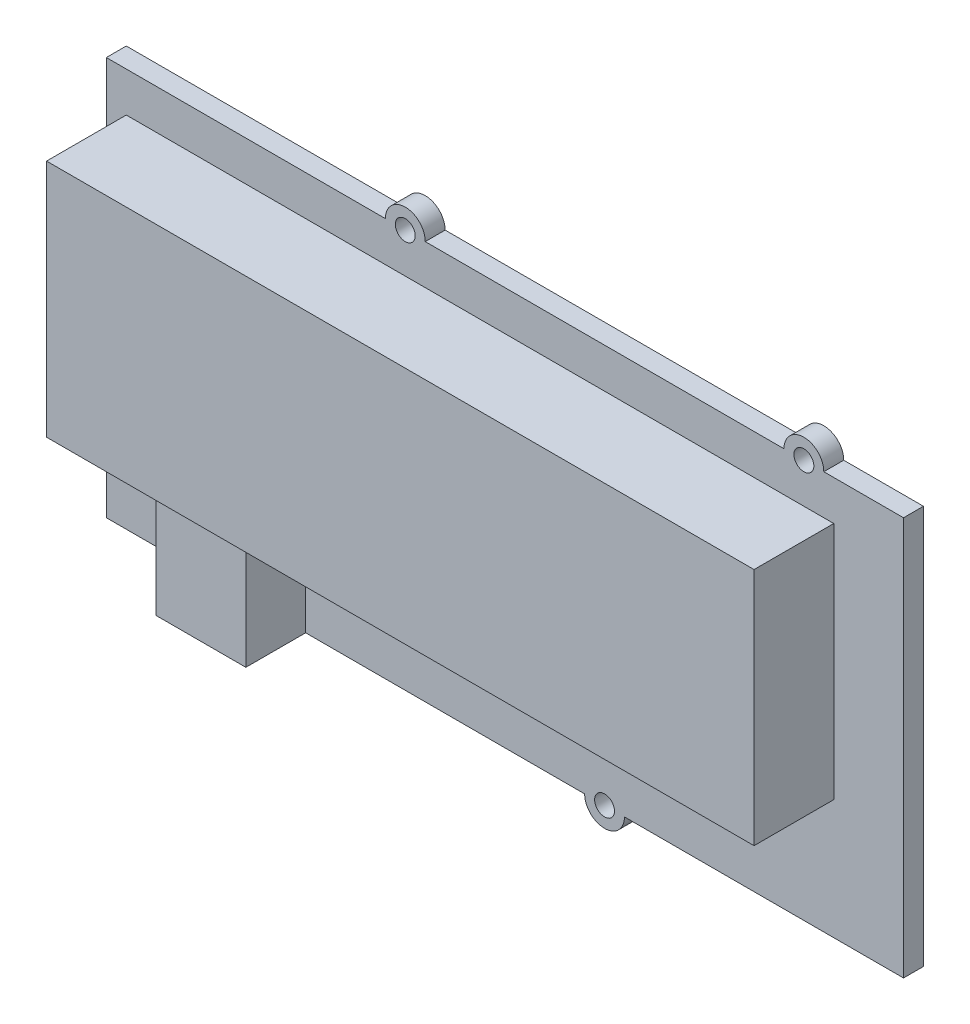
ISO-10303-21;
HEADER;
FILE_DESCRIPTION(('STEP AP214'),'2;1');
FILE_NAME('part.step','',(''),(''),'','','');
FILE_SCHEMA(('AUTOMOTIVE_DESIGN { 1 0 10303 214 1 1 1 1 }'));
ENDSEC;
DATA;
#1=APPLICATION_CONTEXT('core data for automotive mechanical design processes');
#2=APPLICATION_PROTOCOL_DEFINITION('international standard','automotive_design',2000,#1);
#3=PRODUCT_CONTEXT('',#1,'mechanical');
#4=PRODUCT('Part','Part','',(#3));
#5=PRODUCT_RELATED_PRODUCT_CATEGORY('part','',(#4));
#6=PRODUCT_DEFINITION_FORMATION('','',#4);
#7=PRODUCT_DEFINITION_CONTEXT('part definition',#1,'design');
#8=PRODUCT_DEFINITION('design','',#6,#7);
#9=PRODUCT_DEFINITION_SHAPE('','',#8);
#10=(LENGTH_UNIT() NAMED_UNIT(*) SI_UNIT(.MILLI.,.METRE.));
#11=(NAMED_UNIT(*) PLANE_ANGLE_UNIT() SI_UNIT($,.RADIAN.));
#12=(NAMED_UNIT(*) SI_UNIT($,.STERADIAN.) SOLID_ANGLE_UNIT());
#13=UNCERTAINTY_MEASURE_WITH_UNIT(LENGTH_MEASURE(1.E-05),#10,'distance_accuracy_value','');
#14=(GEOMETRIC_REPRESENTATION_CONTEXT(3) GLOBAL_UNCERTAINTY_ASSIGNED_CONTEXT((#13)) GLOBAL_UNIT_ASSIGNED_CONTEXT((#10,
#11,#12)) REPRESENTATION_CONTEXT('',''));
#15=CARTESIAN_POINT('',(0.,0.,0.));
#16=DIRECTION('',(0.,0.,1.));
#17=DIRECTION('',(1.,0.,0.));
#18=AXIS2_PLACEMENT_3D('',#15,#16,#17);
#19=CARTESIAN_POINT('',(0.,0.,2.));
#20=DIRECTION('',(0.,0.,1.));
#21=DIRECTION('',(1.,0.,0.));
#22=AXIS2_PLACEMENT_3D('',#19,#20,#21);
#23=PLANE('',#22);
#24=CARTESIAN_POINT('',(22.3997823196179,9.75675263033948,2.));
#25=DIRECTION('',(0.,0.,1.));
#26=DIRECTION('',(1.,0.,0.));
#27=AXIS2_PLACEMENT_3D('',#24,#25,#26);
#28=CIRCLE('',#27,0.999999999999998);
#29=CARTESIAN_POINT('',(23.3997823196179,9.75675263033948,2.));
#30=VERTEX_POINT('',#29);
#31=EDGE_CURVE('E249',#30,#30,#28,.T.);
#32=ORIENTED_EDGE('',*,*,#31,.F.);
#33=EDGE_LOOP('',(#32));
#34=FACE_BOUND('',#33,.T.);
#35=CARTESIAN_POINT('',(-17.6002176803821,9.75675263033948,2.));
#36=DIRECTION('',(0.,0.,1.));
#37=DIRECTION('',(1.,0.,0.));
#38=AXIS2_PLACEMENT_3D('',#35,#36,#37);
#39=CIRCLE('',#38,1.);
#40=CARTESIAN_POINT('',(-16.6002176803821,9.75675263033948,2.));
#41=VERTEX_POINT('',#40);
#42=EDGE_CURVE('E253',#41,#41,#39,.T.);
#43=ORIENTED_EDGE('',*,*,#42,.F.);
#44=EDGE_LOOP('',(#43));
#45=FACE_BOUND('',#44,.T.);
#46=CARTESIAN_POINT('',(2.39978231961789,-30.2432473696605,2.));
#47=DIRECTION('',(0.,0.,1.));
#48=DIRECTION('',(1.,0.,0.));
#49=AXIS2_PLACEMENT_3D('',#46,#47,#48);
#50=CIRCLE('',#49,1.);
#51=CARTESIAN_POINT('',(3.39978231961789,-30.2432473696605,2.));
#52=VERTEX_POINT('',#51);
#53=EDGE_CURVE('E258',#52,#52,#50,.T.);
#54=ORIENTED_EDGE('',*,*,#53,.F.);
#55=EDGE_LOOP('',(#54));
#56=FACE_BOUND('',#55,.T.);
#57=DIRECTION('',(1.,0.,0.));
#58=VECTOR('',#57,1.);
#59=CARTESIAN_POINT('',(0.,-30.2432473696605,2.));
#60=LINE('',#59,#58);
#61=CARTESIAN_POINT('',(-47.6002176803821,-30.2432473696605,2.));
#62=VERTEX_POINT('',#61);
#63=CARTESIAN_POINT('',(-36.6002176803821,-30.2432473696605,2.));
#64=VERTEX_POINT('',#63);
#65=EDGE_CURVE('E263',#62,#64,#60,.T.);
#66=ORIENTED_EDGE('',*,*,#65,.T.);
#67=DIRECTION('',(0.,-1.,0.));
#68=VECTOR('',#67,1.);
#69=CARTESIAN_POINT('',(-36.6002176803821,-18.2432473696605,2.));
#70=LINE('',#69,#68);
#71=CARTESIAN_POINT('',(-36.6002176803821,-18.2432473696605,2.));
#72=VERTEX_POINT('',#71);
#73=EDGE_CURVE('E197',#72,#64,#70,.T.);
#74=ORIENTED_EDGE('',*,*,#73,.F.);
#75=DIRECTION('',(1.,0.,0.));
#76=VECTOR('',#75,1.);
#77=CARTESIAN_POINT('',(-45.6002176803821,-18.2432473696605,2.));
#78=LINE('',#77,#76);
#79=CARTESIAN_POINT('',(-45.6002176803821,-18.2432473696605,2.));
#80=VERTEX_POINT('',#79);
#81=EDGE_CURVE('E223',#80,#72,#78,.T.);
#82=ORIENTED_EDGE('',*,*,#81,.F.);
#83=DIRECTION('',(0.,-1.,0.));
#84=VECTOR('',#83,1.);
#85=CARTESIAN_POINT('',(-45.6002176803821,5.75675263033948,2.));
#86=LINE('',#85,#84);
#87=CARTESIAN_POINT('',(-45.6002176803821,5.75675263033948,2.));
#88=VERTEX_POINT('',#87);
#89=EDGE_CURVE('E69',#88,#80,#86,.T.);
#90=ORIENTED_EDGE('',*,*,#89,.F.);
#91=DIRECTION('',(-1.,0.,0.));
#92=VECTOR('',#91,1.);
#93=CARTESIAN_POINT('',(-45.6002176803821,5.75675263033948,2.));
#94=LINE('',#93,#92);
#95=CARTESIAN_POINT('',(25.3997823196179,5.75675263033948,2.));
#96=VERTEX_POINT('',#95);
#97=EDGE_CURVE('E213',#96,#88,#94,.T.);
#98=ORIENTED_EDGE('',*,*,#97,.F.);
#99=DIRECTION('',(0.,1.,0.));
#100=VECTOR('',#99,1.);
#101=CARTESIAN_POINT('',(25.3997823196179,5.75675263033948,2.));
#102=LINE('',#101,#100);
#103=CARTESIAN_POINT('',(25.3997823196179,-18.2432473696605,2.));
#104=VERTEX_POINT('',#103);
#105=EDGE_CURVE('E227',#104,#96,#102,.T.);
#106=ORIENTED_EDGE('',*,*,#105,.F.);
#107=CARTESIAN_POINT('',(-27.6002176803821,-18.2432473696605,2.));
#108=VERTEX_POINT('',#107);
#109=EDGE_CURVE('E203',#108,#104,#78,.T.);
#110=ORIENTED_EDGE('',*,*,#109,.F.);
#111=DIRECTION('',(0.,1.,0.));
#112=VECTOR('',#111,1.);
#113=CARTESIAN_POINT('',(-27.6002176803821,-18.2432473696605,2.));
#114=LINE('',#113,#112);
#115=CARTESIAN_POINT('',(-27.6002176803821,-30.2432473696605,2.));
#116=VERTEX_POINT('',#115);
#117=EDGE_CURVE('E193',#116,#108,#114,.T.);
#118=ORIENTED_EDGE('',*,*,#117,.F.);
#119=CARTESIAN_POINT('',(0.39978231961789,-30.2432473696605,2.));
#120=VERTEX_POINT('',#119);
#121=EDGE_CURVE('E262',#116,#120,#60,.T.);
#122=ORIENTED_EDGE('',*,*,#121,.T.);
#123=CARTESIAN_POINT('',(2.39978231961789,-30.2432473696605,2.));
#124=DIRECTION('',(0.,0.,1.));
#125=DIRECTION('',(1.,0.,0.));
#126=AXIS2_PLACEMENT_3D('',#123,#124,#125);
#127=CIRCLE('',#126,2.);
#128=CARTESIAN_POINT('',(4.39978231961789,-30.2432473696605,2.));
#129=VERTEX_POINT('',#128);
#130=EDGE_CURVE('E266',#120,#129,#127,.T.);
#131=ORIENTED_EDGE('',*,*,#130,.T.);
#132=DIRECTION('',(-1.,0.,0.));
#133=VECTOR('',#132,1.);
#134=CARTESIAN_POINT('',(0.,-30.2432473696605,2.));
#135=LINE('',#134,#133);
#136=CARTESIAN_POINT('',(32.3997823196179,-30.2432473696605,2.));
#137=VERTEX_POINT('',#136);
#138=EDGE_CURVE('E269',#137,#129,#135,.T.);
#139=ORIENTED_EDGE('',*,*,#138,.F.);
#140=DIRECTION('',(0.,-1.,0.));
#141=VECTOR('',#140,1.);
#142=CARTESIAN_POINT('',(32.3997823196179,0.,2.));
#143=LINE('',#142,#141);
#144=CARTESIAN_POINT('',(32.3997823196179,9.75675263033948,2.));
#145=VERTEX_POINT('',#144);
#146=EDGE_CURVE('E273',#145,#137,#143,.T.);
#147=ORIENTED_EDGE('',*,*,#146,.F.);
#148=DIRECTION('',(1.,0.,0.));
#149=VECTOR('',#148,1.);
#150=CARTESIAN_POINT('',(0.,9.75675263033948,2.));
#151=LINE('',#150,#149);
#152=CARTESIAN_POINT('',(24.3997823196179,9.75675263033948,2.));
#153=VERTEX_POINT('',#152);
#154=EDGE_CURVE('E277',#153,#145,#151,.T.);
#155=ORIENTED_EDGE('',*,*,#154,.F.);
#156=CARTESIAN_POINT('',(22.3997823196179,9.75675263033948,2.));
#157=DIRECTION('',(0.,0.,1.));
#158=DIRECTION('',(1.,0.,0.));
#159=AXIS2_PLACEMENT_3D('',#156,#157,#158);
#160=CIRCLE('',#159,2.);
#161=CARTESIAN_POINT('',(20.3997823196179,9.75675263033948,2.));
#162=VERTEX_POINT('',#161);
#163=EDGE_CURVE('E281',#162,#153,#160,.F.);
#164=ORIENTED_EDGE('',*,*,#163,.F.);
#165=DIRECTION('',(1.,0.,0.));
#166=VECTOR('',#165,1.);
#167=CARTESIAN_POINT('',(0.,9.75675263033948,2.));
#168=LINE('',#167,#166);
#169=CARTESIAN_POINT('',(-15.6002176803821,9.75675263033948,2.));
#170=VERTEX_POINT('',#169);
#171=EDGE_CURVE('E285',#170,#162,#168,.T.);
#172=ORIENTED_EDGE('',*,*,#171,.F.);
#173=CARTESIAN_POINT('',(-17.6002176803821,9.75675263033948,2.));
#174=DIRECTION('',(0.,0.,1.));
#175=DIRECTION('',(1.,0.,0.));
#176=AXIS2_PLACEMENT_3D('',#173,#174,#175);
#177=CIRCLE('',#176,2.);
#178=CARTESIAN_POINT('',(-19.6002176803821,9.75675263033948,2.));
#179=VERTEX_POINT('',#178);
#180=EDGE_CURVE('E289',#179,#170,#177,.F.);
#181=ORIENTED_EDGE('',*,*,#180,.F.);
#182=DIRECTION('',(1.,0.,0.));
#183=VECTOR('',#182,1.);
#184=CARTESIAN_POINT('',(0.,9.75675263033948,2.));
#185=LINE('',#184,#183);
#186=CARTESIAN_POINT('',(-47.6002176803821,9.75675263033948,2.));
#187=VERTEX_POINT('',#186);
#188=EDGE_CURVE('E293',#187,#179,#185,.T.);
#189=ORIENTED_EDGE('',*,*,#188,.F.);
#190=DIRECTION('',(0.,-1.,0.));
#191=VECTOR('',#190,1.);
#192=CARTESIAN_POINT('',(-47.6002176803821,0.,2.));
#193=LINE('',#192,#191);
#194=EDGE_CURVE('E297',#187,#62,#193,.T.);
#195=ORIENTED_EDGE('',*,*,#194,.T.);
#196=EDGE_LOOP('',(#66,#74,#82,#90,#98,#106,#110,#118,#122,#131,#139,#147,#155,#164,#172,#181,
#189,#195));
#197=FACE_BOUND('',#196,.T.);
#198=ADVANCED_FACE('F45',(#34,#45,#56,#197),#23,.T.);
#199=CARTESIAN_POINT('',(-45.6002176803821,-18.2432473696605,10.));
#200=DIRECTION('',(0.,1.,0.));
#201=DIRECTION('',(0.,0.,1.));
#202=AXIS2_PLACEMENT_3D('',#199,#200,#201);
#203=PLANE('',#202);
#204=DIRECTION('',(0.,0.,-1.));
#205=VECTOR('',#204,1.);
#206=CARTESIAN_POINT('',(-36.6002176803821,-18.2432473696605,8.));
#207=LINE('',#206,#205);
#208=CARTESIAN_POINT('',(-36.6002176803821,-18.2432473696605,8.));
#209=VERTEX_POINT('',#208);
#210=EDGE_CURVE('E635',#209,#72,#207,.T.);
#211=ORIENTED_EDGE('',*,*,#210,.F.);
#212=DIRECTION('',(-1.,0.,0.));
#213=VECTOR('',#212,1.);
#214=CARTESIAN_POINT('',(-36.6002176803821,-18.2432473696605,8.));
#215=LINE('',#214,#213);
#216=CARTESIAN_POINT('',(-27.6002176803821,-18.2432473696605,8.));
#217=VERTEX_POINT('',#216);
#218=EDGE_CURVE('E189',#217,#209,#215,.T.);
#219=ORIENTED_EDGE('',*,*,#218,.F.);
#220=DIRECTION('',(0.,0.,-1.));
#221=VECTOR('',#220,1.);
#222=CARTESIAN_POINT('',(-27.6002176803821,-18.2432473696605,8.));
#223=LINE('',#222,#221);
#224=EDGE_CURVE('E61',#217,#108,#223,.T.);
#225=ORIENTED_EDGE('',*,*,#224,.T.);
#226=ORIENTED_EDGE('',*,*,#109,.T.);
#227=DIRECTION('',(0.,0.,-1.));
#228=VECTOR('',#227,1.);
#229=CARTESIAN_POINT('',(25.3997823196179,-18.2432473696605,10.));
#230=LINE('',#229,#228);
#231=CARTESIAN_POINT('',(25.3997823196179,-18.2432473696605,10.));
#232=VERTEX_POINT('',#231);
#233=EDGE_CURVE('E240',#232,#104,#230,.T.);
#234=ORIENTED_EDGE('',*,*,#233,.F.);
#235=DIRECTION('',(1.,0.,0.));
#236=VECTOR('',#235,1.);
#237=CARTESIAN_POINT('',(-45.6002176803821,-18.2432473696605,10.));
#238=LINE('',#237,#236);
#239=CARTESIAN_POINT('',(-45.6002176803821,-18.2432473696605,10.));
#240=VERTEX_POINT('',#239);
#241=EDGE_CURVE('E212',#240,#232,#238,.T.);
#242=ORIENTED_EDGE('',*,*,#241,.F.);
#243=DIRECTION('',(0.,0.,-1.));
#244=VECTOR('',#243,1.);
#245=CARTESIAN_POINT('',(-45.6002176803821,-18.2432473696605,10.));
#246=LINE('',#245,#244);
#247=EDGE_CURVE('E244',#240,#80,#246,.T.);
#248=ORIENTED_EDGE('',*,*,#247,.T.);
#249=ORIENTED_EDGE('',*,*,#81,.T.);
#250=EDGE_LOOP('',(#211,#219,#225,#226,#234,#242,#248,#249));
#251=FACE_BOUND('',#250,.T.);
#252=ADVANCED_FACE('F428',(#251),#203,.F.);
#253=CARTESIAN_POINT('',(0.,-30.2432473696605,2.));
#254=DIRECTION('',(0.,1.,0.));
#255=DIRECTION('',(0.,0.,1.));
#256=AXIS2_PLACEMENT_3D('',#253,#254,#255);
#257=PLANE('',#256);
#258=DIRECTION('',(1.,0.,0.));
#259=VECTOR('',#258,1.);
#260=CARTESIAN_POINT('',(0.,-30.2432473696605,0.));
#261=LINE('',#260,#259);
#262=CARTESIAN_POINT('',(-47.6002176803821,-30.2432473696605,0.));
#263=VERTEX_POINT('',#262);
#264=CARTESIAN_POINT('',(0.39978231961789,-30.2432473696605,0.));
#265=VERTEX_POINT('',#264);
#266=EDGE_CURVE('E312',#263,#265,#261,.T.);
#267=ORIENTED_EDGE('',*,*,#266,.T.);
#268=DIRECTION('',(0.,0.,-1.));
#269=VECTOR('',#268,1.);
#270=CARTESIAN_POINT('',(0.39978231961789,-30.2432473696605,2.));
#271=LINE('',#270,#269);
#272=EDGE_CURVE('E11',#120,#265,#271,.T.);
#273=ORIENTED_EDGE('',*,*,#272,.F.);
#274=ORIENTED_EDGE('',*,*,#121,.F.);
#275=DIRECTION('',(0.,0.,-1.));
#276=VECTOR('',#275,1.);
#277=CARTESIAN_POINT('',(-27.6002176803821,-30.2432473696605,8.));
#278=LINE('',#277,#276);
#279=CARTESIAN_POINT('',(-27.6002176803821,-30.2432473696605,8.));
#280=VERTEX_POINT('',#279);
#281=EDGE_CURVE('E180',#280,#116,#278,.T.);
#282=ORIENTED_EDGE('',*,*,#281,.F.);
#283=DIRECTION('',(1.,0.,0.));
#284=VECTOR('',#283,1.);
#285=CARTESIAN_POINT('',(-36.6002176803821,-30.2432473696605,8.));
#286=LINE('',#285,#284);
#287=CARTESIAN_POINT('',(-36.6002176803821,-30.2432473696605,8.));
#288=VERTEX_POINT('',#287);
#289=EDGE_CURVE('E171',#288,#280,#286,.T.);
#290=ORIENTED_EDGE('',*,*,#289,.F.);
#291=DIRECTION('',(0.,0.,-1.));
#292=VECTOR('',#291,1.);
#293=CARTESIAN_POINT('',(-36.6002176803821,-30.2432473696605,8.));
#294=LINE('',#293,#292);
#295=EDGE_CURVE('E177',#288,#64,#294,.T.);
#296=ORIENTED_EDGE('',*,*,#295,.T.);
#297=ORIENTED_EDGE('',*,*,#65,.F.);
#298=DIRECTION('',(0.,0.,-1.));
#299=VECTOR('',#298,1.);
#300=CARTESIAN_POINT('',(-47.6002176803821,-30.2432473696605,2.));
#301=LINE('',#300,#299);
#302=EDGE_CURVE('E300',#62,#263,#301,.T.);
#303=ORIENTED_EDGE('',*,*,#302,.T.);
#304=EDGE_LOOP('',(#267,#273,#274,#282,#290,#296,#297,#303));
#305=FACE_BOUND('',#304,.T.);
#306=ADVANCED_FACE('F174',(#305),#257,.F.);
#307=CARTESIAN_POINT('',(2.39978231961789,-30.2432473696605,2.));
#308=DIRECTION('',(0.,0.,-1.));
#309=DIRECTION('',(-1.,0.,0.));
#310=AXIS2_PLACEMENT_3D('',#307,#308,#309);
#311=CYLINDRICAL_SURFACE('',#310,2.);
#312=CARTESIAN_POINT('',(2.39978231961789,-30.2432473696605,0.));
#313=DIRECTION('',(0.,0.,1.));
#314=DIRECTION('',(1.,0.,0.));
#315=AXIS2_PLACEMENT_3D('',#312,#313,#314);
#316=CIRCLE('',#315,2.);
#317=CARTESIAN_POINT('',(4.39978231961789,-30.2432473696605,0.));
#318=VERTEX_POINT('',#317);
#319=EDGE_CURVE('E315',#265,#318,#316,.T.);
#320=ORIENTED_EDGE('',*,*,#319,.T.);
#321=DIRECTION('',(0.,0.,-1.));
#322=VECTOR('',#321,1.);
#323=CARTESIAN_POINT('',(4.39978231961789,-30.2432473696605,2.));
#324=LINE('',#323,#322);
#325=EDGE_CURVE('E54',#129,#318,#324,.T.);
#326=ORIENTED_EDGE('',*,*,#325,.F.);
#327=ORIENTED_EDGE('',*,*,#130,.F.);
#328=ORIENTED_EDGE('',*,*,#272,.T.);
#329=EDGE_LOOP('',(#320,#326,#327,#328));
#330=FACE_BOUND('',#329,.T.);
#331=ADVANCED_FACE('F380',(#330),#311,.T.);
#332=CARTESIAN_POINT('',(0.,-30.2432473696605,2.));
#333=DIRECTION('',(0.,-1.,0.));
#334=DIRECTION('',(0.,0.,-1.));
#335=AXIS2_PLACEMENT_3D('',#332,#333,#334);
#336=PLANE('',#335);
#337=DIRECTION('',(-1.,0.,0.));
#338=VECTOR('',#337,1.);
#339=CARTESIAN_POINT('',(0.,-30.2432473696605,0.));
#340=LINE('',#339,#338);
#341=CARTESIAN_POINT('',(32.3997823196179,-30.2432473696605,0.));
#342=VERTEX_POINT('',#341);
#343=EDGE_CURVE('E319',#342,#318,#340,.T.);
#344=ORIENTED_EDGE('',*,*,#343,.F.);
#345=DIRECTION('',(0.,0.,-1.));
#346=VECTOR('',#345,1.);
#347=CARTESIAN_POINT('',(32.3997823196179,-30.2432473696605,2.));
#348=LINE('',#347,#346);
#349=EDGE_CURVE('E370',#137,#342,#348,.T.);
#350=ORIENTED_EDGE('',*,*,#349,.F.);
#351=ORIENTED_EDGE('',*,*,#138,.T.);
#352=ORIENTED_EDGE('',*,*,#325,.T.);
#353=EDGE_LOOP('',(#344,#350,#351,#352));
#354=FACE_BOUND('',#353,.T.);
#355=ADVANCED_FACE('F376',(#354),#336,.T.);
#356=CARTESIAN_POINT('',(32.3997823196179,0.,2.));
#357=DIRECTION('',(1.,0.,0.));
#358=DIRECTION('',(0.,1.,0.));
#359=AXIS2_PLACEMENT_3D('',#356,#357,#358);
#360=PLANE('',#359);
#361=DIRECTION('',(0.,-1.,0.));
#362=VECTOR('',#361,1.);
#363=CARTESIAN_POINT('',(32.3997823196179,0.,0.));
#364=LINE('',#363,#362);
#365=CARTESIAN_POINT('',(32.3997823196179,9.75675263033948,0.));
#366=VERTEX_POINT('',#365);
#367=EDGE_CURVE('E323',#366,#342,#364,.T.);
#368=ORIENTED_EDGE('',*,*,#367,.F.);
#369=DIRECTION('',(0.,0.,-1.));
#370=VECTOR('',#369,1.);
#371=CARTESIAN_POINT('',(32.3997823196179,9.75675263033948,2.));
#372=LINE('',#371,#370);
#373=EDGE_CURVE('E367',#145,#366,#372,.T.);
#374=ORIENTED_EDGE('',*,*,#373,.F.);
#375=ORIENTED_EDGE('',*,*,#146,.T.);
#376=ORIENTED_EDGE('',*,*,#349,.T.);
#377=EDGE_LOOP('',(#368,#374,#375,#376));
#378=FACE_BOUND('',#377,.T.);
#379=ADVANCED_FACE('F388',(#378),#360,.T.);
#380=CARTESIAN_POINT('',(0.,9.75675263033948,2.));
#381=DIRECTION('',(0.,1.,0.));
#382=DIRECTION('',(0.,0.,1.));
#383=AXIS2_PLACEMENT_3D('',#380,#381,#382);
#384=PLANE('',#383);
#385=DIRECTION('',(1.,0.,0.));
#386=VECTOR('',#385,1.);
#387=CARTESIAN_POINT('',(0.,9.75675263033948,0.));
#388=LINE('',#387,#386);
#389=CARTESIAN_POINT('',(24.3997823196179,9.75675263033948,0.));
#390=VERTEX_POINT('',#389);
#391=EDGE_CURVE('E327',#390,#366,#388,.T.);
#392=ORIENTED_EDGE('',*,*,#391,.F.);
#393=DIRECTION('',(0.,0.,-1.));
#394=VECTOR('',#393,1.);
#395=CARTESIAN_POINT('',(24.3997823196179,9.75675263033948,2.));
#396=LINE('',#395,#394);
#397=EDGE_CURVE('E364',#153,#390,#396,.T.);
#398=ORIENTED_EDGE('',*,*,#397,.F.);
#399=ORIENTED_EDGE('',*,*,#154,.T.);
#400=ORIENTED_EDGE('',*,*,#373,.T.);
#401=EDGE_LOOP('',(#392,#398,#399,#400));
#402=FACE_BOUND('',#401,.T.);
#403=ADVANCED_FACE('F413',(#402),#384,.T.);
#404=CARTESIAN_POINT('',(22.3997823196179,9.75675263033948,2.));
#405=DIRECTION('',(0.,0.,-1.));
#406=DIRECTION('',(-1.,0.,0.));
#407=AXIS2_PLACEMENT_3D('',#404,#405,#406);
#408=CYLINDRICAL_SURFACE('',#407,2.);
#409=CARTESIAN_POINT('',(22.3997823196179,9.75675263033948,0.));
#410=DIRECTION('',(0.,0.,1.));
#411=DIRECTION('',(1.,0.,0.));
#412=AXIS2_PLACEMENT_3D('',#409,#410,#411);
#413=CIRCLE('',#412,2.);
#414=CARTESIAN_POINT('',(20.3997823196179,9.75675263033948,0.));
#415=VERTEX_POINT('',#414);
#416=EDGE_CURVE('E331',#415,#390,#413,.F.);
#417=ORIENTED_EDGE('',*,*,#416,.F.);
#418=DIRECTION('',(0.,0.,-1.));
#419=VECTOR('',#418,1.);
#420=CARTESIAN_POINT('',(20.3997823196179,9.75675263033948,2.));
#421=LINE('',#420,#419);
#422=EDGE_CURVE('E361',#162,#415,#421,.T.);
#423=ORIENTED_EDGE('',*,*,#422,.F.);
#424=ORIENTED_EDGE('',*,*,#163,.T.);
#425=ORIENTED_EDGE('',*,*,#397,.T.);
#426=EDGE_LOOP('',(#417,#423,#424,#425));
#427=FACE_BOUND('',#426,.T.);
#428=ADVANCED_FACE('F411',(#427),#408,.T.);
#429=CARTESIAN_POINT('',(0.,9.75675263033948,2.));
#430=DIRECTION('',(0.,1.,0.));
#431=DIRECTION('',(0.,0.,1.));
#432=AXIS2_PLACEMENT_3D('',#429,#430,#431);
#433=PLANE('',#432);
#434=DIRECTION('',(1.,0.,0.));
#435=VECTOR('',#434,1.);
#436=CARTESIAN_POINT('',(0.,9.75675263033948,0.));
#437=LINE('',#436,#435);
#438=CARTESIAN_POINT('',(-15.6002176803821,9.75675263033948,0.));
#439=VERTEX_POINT('',#438);
#440=EDGE_CURVE('E335',#439,#415,#437,.T.);
#441=ORIENTED_EDGE('',*,*,#440,.F.);
#442=DIRECTION('',(0.,0.,-1.));
#443=VECTOR('',#442,1.);
#444=CARTESIAN_POINT('',(-15.6002176803821,9.75675263033948,2.));
#445=LINE('',#444,#443);
#446=EDGE_CURVE('E358',#170,#439,#445,.T.);
#447=ORIENTED_EDGE('',*,*,#446,.F.);
#448=ORIENTED_EDGE('',*,*,#171,.T.);
#449=ORIENTED_EDGE('',*,*,#422,.T.);
#450=EDGE_LOOP('',(#441,#447,#448,#449));
#451=FACE_BOUND('',#450,.T.);
#452=ADVANCED_FACE('F407',(#451),#433,.T.);
#453=CARTESIAN_POINT('',(-17.6002176803821,9.75675263033948,2.));
#454=DIRECTION('',(0.,0.,-1.));
#455=DIRECTION('',(-1.,0.,0.));
#456=AXIS2_PLACEMENT_3D('',#453,#454,#455);
#457=CYLINDRICAL_SURFACE('',#456,2.);
#458=CARTESIAN_POINT('',(-17.6002176803821,9.75675263033948,0.));
#459=DIRECTION('',(0.,0.,1.));
#460=DIRECTION('',(1.,0.,0.));
#461=AXIS2_PLACEMENT_3D('',#458,#459,#460);
#462=CIRCLE('',#461,2.);
#463=CARTESIAN_POINT('',(-19.6002176803821,9.75675263033948,0.));
#464=VERTEX_POINT('',#463);
#465=EDGE_CURVE('E339',#464,#439,#462,.F.);
#466=ORIENTED_EDGE('',*,*,#465,.F.);
#467=DIRECTION('',(0.,0.,-1.));
#468=VECTOR('',#467,1.);
#469=CARTESIAN_POINT('',(-19.6002176803821,9.75675263033948,2.));
#470=LINE('',#469,#468);
#471=EDGE_CURVE('E355',#179,#464,#470,.T.);
#472=ORIENTED_EDGE('',*,*,#471,.F.);
#473=ORIENTED_EDGE('',*,*,#180,.T.);
#474=ORIENTED_EDGE('',*,*,#446,.T.);
#475=EDGE_LOOP('',(#466,#472,#473,#474));
#476=FACE_BOUND('',#475,.T.);
#477=ADVANCED_FACE('F403',(#476),#457,.T.);
#478=CARTESIAN_POINT('',(0.,9.75675263033948,2.));
#479=DIRECTION('',(0.,1.,0.));
#480=DIRECTION('',(0.,0.,1.));
#481=AXIS2_PLACEMENT_3D('',#478,#479,#480);
#482=PLANE('',#481);
#483=DIRECTION('',(1.,0.,0.));
#484=VECTOR('',#483,1.);
#485=CARTESIAN_POINT('',(0.,9.75675263033948,0.));
#486=LINE('',#485,#484);
#487=CARTESIAN_POINT('',(-47.6002176803821,9.75675263033948,0.));
#488=VERTEX_POINT('',#487);
#489=EDGE_CURVE('E343',#488,#464,#486,.T.);
#490=ORIENTED_EDGE('',*,*,#489,.F.);
#491=DIRECTION('',(0.,0.,-1.));
#492=VECTOR('',#491,1.);
#493=CARTESIAN_POINT('',(-47.6002176803821,9.75675263033948,2.));
#494=LINE('',#493,#492);
#495=EDGE_CURVE('E352',#187,#488,#494,.T.);
#496=ORIENTED_EDGE('',*,*,#495,.F.);
#497=ORIENTED_EDGE('',*,*,#188,.T.);
#498=ORIENTED_EDGE('',*,*,#471,.T.);
#499=EDGE_LOOP('',(#490,#496,#497,#498));
#500=FACE_BOUND('',#499,.T.);
#501=ADVANCED_FACE('F397',(#500),#482,.T.);
#502=CARTESIAN_POINT('',(2.39978231961789,-30.2432473696605,2.));
#503=DIRECTION('',(0.,0.,-1.));
#504=DIRECTION('',(-1.,0.,0.));
#505=AXIS2_PLACEMENT_3D('',#502,#503,#504);
#506=CYLINDRICAL_SURFACE('',#505,1.);
#507=ORIENTED_EDGE('',*,*,#53,.T.);
#508=EDGE_LOOP('',(#507));
#509=FACE_BOUND('',#508,.T.);
#510=CARTESIAN_POINT('',(2.39978231961789,-30.2432473696605,0.));
#511=DIRECTION('',(0.,0.,1.));
#512=DIRECTION('',(1.,0.,0.));
#513=AXIS2_PLACEMENT_3D('',#510,#511,#512);
#514=CIRCLE('',#513,1.);
#515=CARTESIAN_POINT('',(3.39978231961789,-30.2432473696605,0.));
#516=VERTEX_POINT('',#515);
#517=EDGE_CURVE('E308',#516,#516,#514,.T.);
#518=ORIENTED_EDGE('',*,*,#517,.F.);
#519=EDGE_LOOP('',(#518));
#520=FACE_BOUND('',#519,.T.);
#521=ADVANCED_FACE('F534',(#509,#520),#506,.F.);
#522=CARTESIAN_POINT('',(-17.6002176803821,9.75675263033948,2.));
#523=DIRECTION('',(0.,0.,-1.));
#524=DIRECTION('',(-1.,0.,0.));
#525=AXIS2_PLACEMENT_3D('',#522,#523,#524);
#526=CYLINDRICAL_SURFACE('',#525,1.);
#527=ORIENTED_EDGE('',*,*,#42,.T.);
#528=EDGE_LOOP('',(#527));
#529=FACE_BOUND('',#528,.T.);
#530=CARTESIAN_POINT('',(-17.6002176803821,9.75675263033948,0.));
#531=DIRECTION('',(0.,0.,1.));
#532=DIRECTION('',(1.,0.,0.));
#533=AXIS2_PLACEMENT_3D('',#530,#531,#532);
#534=CIRCLE('',#533,1.);
#535=CARTESIAN_POINT('',(-16.6002176803821,9.75675263033948,0.));
#536=VERTEX_POINT('',#535);
#537=EDGE_CURVE('E304',#536,#536,#534,.T.);
#538=ORIENTED_EDGE('',*,*,#537,.F.);
#539=EDGE_LOOP('',(#538));
#540=FACE_BOUND('',#539,.T.);
#541=ADVANCED_FACE('F424',(#529,#540),#526,.F.);
#542=CARTESIAN_POINT('',(22.3997823196179,9.75675263033948,2.));
#543=DIRECTION('',(0.,0.,-1.));
#544=DIRECTION('',(-1.,0.,0.));
#545=AXIS2_PLACEMENT_3D('',#542,#543,#544);
#546=CYLINDRICAL_SURFACE('',#545,0.999999999999998);
#547=ORIENTED_EDGE('',*,*,#31,.T.);
#548=EDGE_LOOP('',(#547));
#549=FACE_BOUND('',#548,.T.);
#550=CARTESIAN_POINT('',(22.3997823196179,9.75675263033948,0.));
#551=DIRECTION('',(0.,0.,1.));
#552=DIRECTION('',(1.,0.,0.));
#553=AXIS2_PLACEMENT_3D('',#550,#551,#552);
#554=CIRCLE('',#553,0.999999999999998);
#555=CARTESIAN_POINT('',(23.3997823196179,9.75675263033948,0.));
#556=VERTEX_POINT('',#555);
#557=EDGE_CURVE('E248',#556,#556,#554,.T.);
#558=ORIENTED_EDGE('',*,*,#557,.F.);
#559=EDGE_LOOP('',(#558));
#560=FACE_BOUND('',#559,.T.);
#561=ADVANCED_FACE('F47',(#549,#560),#546,.F.);
#562=CARTESIAN_POINT('',(-47.6002176803821,0.,2.));
#563=DIRECTION('',(1.,0.,0.));
#564=DIRECTION('',(0.,1.,0.));
#565=AXIS2_PLACEMENT_3D('',#562,#563,#564);
#566=PLANE('',#565);
#567=DIRECTION('',(0.,-1.,0.));
#568=VECTOR('',#567,1.);
#569=CARTESIAN_POINT('',(-47.6002176803821,0.,0.));
#570=LINE('',#569,#568);
#571=EDGE_CURVE('E254',#488,#263,#570,.T.);
#572=ORIENTED_EDGE('',*,*,#571,.T.);
#573=ORIENTED_EDGE('',*,*,#302,.F.);
#574=ORIENTED_EDGE('',*,*,#194,.F.);
#575=ORIENTED_EDGE('',*,*,#495,.T.);
#576=EDGE_LOOP('',(#572,#573,#574,#575));
#577=FACE_BOUND('',#576,.T.);
#578=ADVANCED_FACE('F414',(#577),#566,.F.);
#579=CARTESIAN_POINT('',(0.,0.,0.));
#580=DIRECTION('',(0.,0.,1.));
#581=DIRECTION('',(1.,0.,0.));
#582=AXIS2_PLACEMENT_3D('',#579,#580,#581);
#583=PLANE('',#582);
#584=ORIENTED_EDGE('',*,*,#557,.T.);
#585=EDGE_LOOP('',(#584));
#586=FACE_BOUND('',#585,.T.);
#587=ORIENTED_EDGE('',*,*,#537,.T.);
#588=EDGE_LOOP('',(#587));
#589=FACE_BOUND('',#588,.T.);
#590=ORIENTED_EDGE('',*,*,#517,.T.);
#591=EDGE_LOOP('',(#590));
#592=FACE_BOUND('',#591,.T.);
#593=ORIENTED_EDGE('',*,*,#266,.F.);
#594=ORIENTED_EDGE('',*,*,#571,.F.);
#595=ORIENTED_EDGE('',*,*,#489,.T.);
#596=ORIENTED_EDGE('',*,*,#465,.T.);
#597=ORIENTED_EDGE('',*,*,#440,.T.);
#598=ORIENTED_EDGE('',*,*,#416,.T.);
#599=ORIENTED_EDGE('',*,*,#391,.T.);
#600=ORIENTED_EDGE('',*,*,#367,.T.);
#601=ORIENTED_EDGE('',*,*,#343,.T.);
#602=ORIENTED_EDGE('',*,*,#319,.F.);
#603=EDGE_LOOP('',(#593,#594,#595,#596,#597,#598,#599,#600,#601,#602));
#604=FACE_BOUND('',#603,.T.);
#605=ADVANCED_FACE('F384',(#586,#589,#592,#604),#583,.F.);
#606=CARTESIAN_POINT('',(-45.6002176803821,5.75675263033948,10.));
#607=DIRECTION('',(1.,0.,0.));
#608=DIRECTION('',(0.,0.,-1.));
#609=AXIS2_PLACEMENT_3D('',#606,#607,#608);
#610=PLANE('',#609);
#611=ORIENTED_EDGE('',*,*,#89,.T.);
#612=ORIENTED_EDGE('',*,*,#247,.F.);
#613=DIRECTION('',(0.,-1.,0.));
#614=VECTOR('',#613,1.);
#615=CARTESIAN_POINT('',(-45.6002176803821,5.75675263033948,10.));
#616=LINE('',#615,#614);
#617=CARTESIAN_POINT('',(-45.6002176803821,5.75675263033948,10.));
#618=VERTEX_POINT('',#617);
#619=EDGE_CURVE('E208',#618,#240,#616,.T.);
#620=ORIENTED_EDGE('',*,*,#619,.F.);
#621=DIRECTION('',(0.,0.,-1.));
#622=VECTOR('',#621,1.);
#623=CARTESIAN_POINT('',(-45.6002176803821,5.75675263033948,10.));
#624=LINE('',#623,#622);
#625=EDGE_CURVE('E221',#618,#88,#624,.T.);
#626=ORIENTED_EDGE('',*,*,#625,.T.);
#627=EDGE_LOOP('',(#611,#612,#620,#626));
#628=FACE_BOUND('',#627,.T.);
#629=ADVANCED_FACE('F421',(#628),#610,.F.);
#630=CARTESIAN_POINT('',(25.3997823196179,5.75675263033948,10.));
#631=DIRECTION('',(-1.,0.,0.));
#632=DIRECTION('',(0.,-1.,0.));
#633=AXIS2_PLACEMENT_3D('',#630,#631,#632);
#634=PLANE('',#633);
#635=ORIENTED_EDGE('',*,*,#105,.T.);
#636=DIRECTION('',(0.,0.,-1.));
#637=VECTOR('',#636,1.);
#638=CARTESIAN_POINT('',(25.3997823196179,5.75675263033948,10.));
#639=LINE('',#638,#637);
#640=CARTESIAN_POINT('',(25.3997823196179,5.75675263033948,10.));
#641=VERTEX_POINT('',#640);
#642=EDGE_CURVE('E236',#641,#96,#639,.T.);
#643=ORIENTED_EDGE('',*,*,#642,.F.);
#644=DIRECTION('',(0.,1.,0.));
#645=VECTOR('',#644,1.);
#646=CARTESIAN_POINT('',(25.3997823196179,5.75675263033948,10.));
#647=LINE('',#646,#645);
#648=EDGE_CURVE('E216',#232,#641,#647,.T.);
#649=ORIENTED_EDGE('',*,*,#648,.F.);
#650=ORIENTED_EDGE('',*,*,#233,.T.);
#651=EDGE_LOOP('',(#635,#643,#649,#650));
#652=FACE_BOUND('',#651,.T.);
#653=ADVANCED_FACE('F441',(#652),#634,.F.);
#654=CARTESIAN_POINT('',(-45.6002176803821,5.75675263033948,10.));
#655=DIRECTION('',(0.,-1.,0.));
#656=DIRECTION('',(0.,0.,-1.));
#657=AXIS2_PLACEMENT_3D('',#654,#655,#656);
#658=PLANE('',#657);
#659=ORIENTED_EDGE('',*,*,#97,.T.);
#660=ORIENTED_EDGE('',*,*,#625,.F.);
#661=DIRECTION('',(-1.,0.,0.));
#662=VECTOR('',#661,1.);
#663=CARTESIAN_POINT('',(-45.6002176803821,5.75675263033948,10.));
#664=LINE('',#663,#662);
#665=EDGE_CURVE('E219',#641,#618,#664,.T.);
#666=ORIENTED_EDGE('',*,*,#665,.F.);
#667=ORIENTED_EDGE('',*,*,#642,.T.);
#668=EDGE_LOOP('',(#659,#660,#666,#667));
#669=FACE_BOUND('',#668,.T.);
#670=ADVANCED_FACE('F446',(#669),#658,.F.);
#671=CARTESIAN_POINT('',(0.,0.,10.));
#672=DIRECTION('',(0.,0.,1.));
#673=DIRECTION('',(1.,0.,0.));
#674=AXIS2_PLACEMENT_3D('',#671,#672,#673);
#675=PLANE('',#674);
#676=ORIENTED_EDGE('',*,*,#619,.T.);
#677=ORIENTED_EDGE('',*,*,#241,.T.);
#678=ORIENTED_EDGE('',*,*,#648,.T.);
#679=ORIENTED_EDGE('',*,*,#665,.T.);
#680=EDGE_LOOP('',(#676,#677,#678,#679));
#681=FACE_BOUND('',#680,.T.);
#682=ADVANCED_FACE('F450',(#681),#675,.T.);
#683=CARTESIAN_POINT('',(-36.6002176803821,-18.2432473696605,8.));
#684=DIRECTION('',(1.,0.,0.));
#685=DIRECTION('',(0.,0.,-1.));
#686=AXIS2_PLACEMENT_3D('',#683,#684,#685);
#687=PLANE('',#686);
#688=ORIENTED_EDGE('',*,*,#73,.T.);
#689=ORIENTED_EDGE('',*,*,#295,.F.);
#690=DIRECTION('',(0.,-1.,0.));
#691=VECTOR('',#690,1.);
#692=CARTESIAN_POINT('',(-36.6002176803821,-18.2432473696605,8.));
#693=LINE('',#692,#691);
#694=EDGE_CURVE('E184',#209,#288,#693,.T.);
#695=ORIENTED_EDGE('',*,*,#694,.F.);
#696=ORIENTED_EDGE('',*,*,#210,.T.);
#697=EDGE_LOOP('',(#688,#689,#695,#696));
#698=FACE_BOUND('',#697,.T.);
#699=ADVANCED_FACE('F195',(#698),#687,.F.);
#700=CARTESIAN_POINT('',(-27.6002176803821,-18.2432473696605,8.));
#701=DIRECTION('',(-1.,0.,0.));
#702=DIRECTION('',(0.,0.,1.));
#703=AXIS2_PLACEMENT_3D('',#700,#701,#702);
#704=PLANE('',#703);
#705=ORIENTED_EDGE('',*,*,#117,.T.);
#706=ORIENTED_EDGE('',*,*,#224,.F.);
#707=DIRECTION('',(0.,1.,0.));
#708=VECTOR('',#707,1.);
#709=CARTESIAN_POINT('',(-27.6002176803821,-18.2432473696605,8.));
#710=LINE('',#709,#708);
#711=EDGE_CURVE('E183',#280,#217,#710,.T.);
#712=ORIENTED_EDGE('',*,*,#711,.F.);
#713=ORIENTED_EDGE('',*,*,#281,.T.);
#714=EDGE_LOOP('',(#705,#706,#712,#713));
#715=FACE_BOUND('',#714,.T.);
#716=ADVANCED_FACE('F456',(#715),#704,.F.);
#717=CARTESIAN_POINT('',(0.,0.,8.));
#718=DIRECTION('',(0.,0.,1.));
#719=DIRECTION('',(1.,0.,0.));
#720=AXIS2_PLACEMENT_3D('',#717,#718,#719);
#721=PLANE('',#720);
#722=ORIENTED_EDGE('',*,*,#694,.T.);
#723=ORIENTED_EDGE('',*,*,#289,.T.);
#724=ORIENTED_EDGE('',*,*,#711,.T.);
#725=ORIENTED_EDGE('',*,*,#218,.T.);
#726=EDGE_LOOP('',(#722,#723,#724,#725));
#727=FACE_BOUND('',#726,.T.);
#728=ADVANCED_FACE('F187',(#727),#721,.T.);
#729=CLOSED_SHELL('',(#198,#252,#306,#331,#355,#379,#403,#428,#452,#477,#501,#521,#541,#561,
#578,#605,#629,#653,#670,#682,#699,#716,#728));
#730=MANIFOLD_SOLID_BREP('B2',#729);
#731=ADVANCED_BREP_SHAPE_REPRESENTATION('',(#18,#730),#14);
#732=SHAPE_DEFINITION_REPRESENTATION(#9,#731);
ENDSEC;
END-ISO-10303-21;
